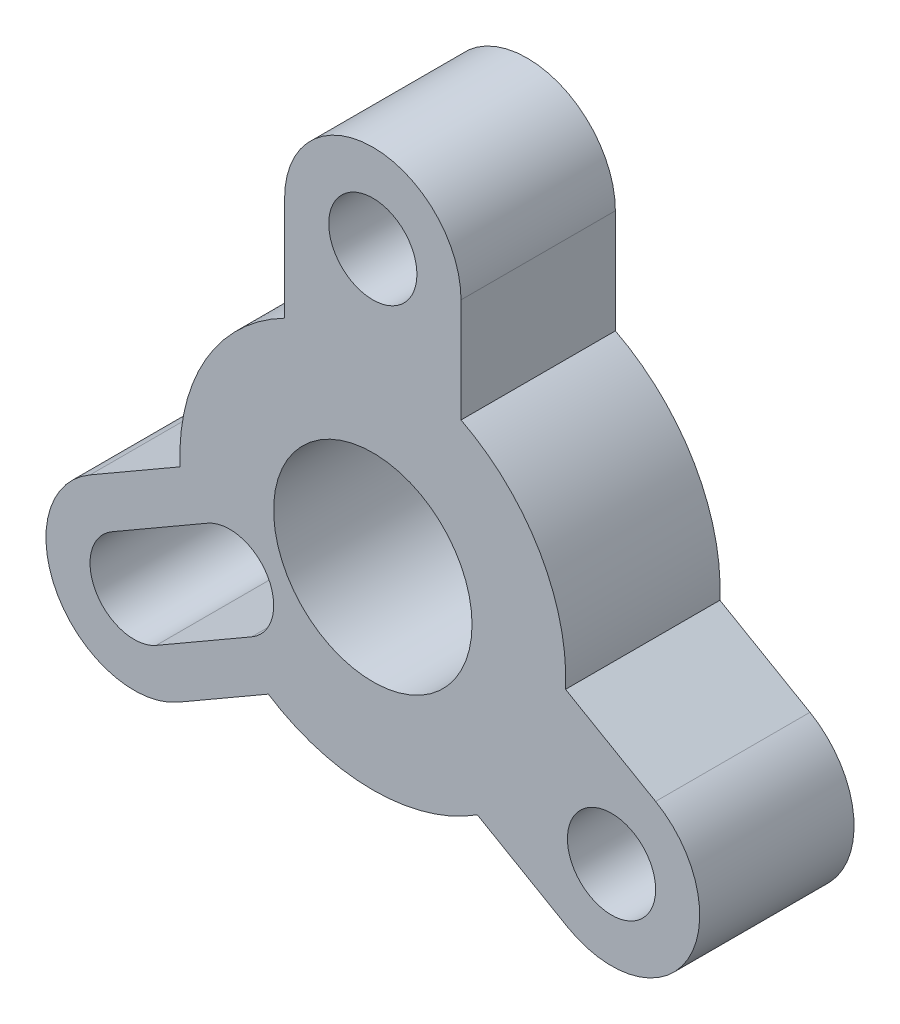
ISO-10303-21;
HEADER;
FILE_DESCRIPTION(('STEP AP214'),'2;1');
FILE_NAME('part.step','',(''),(''),'','','');
FILE_SCHEMA(('AUTOMOTIVE_DESIGN { 1 0 10303 214 1 1 1 1 }'));
ENDSEC;
DATA;
#1=APPLICATION_CONTEXT('core data for automotive mechanical design processes');
#2=APPLICATION_PROTOCOL_DEFINITION('international standard','automotive_design',2000,#1);
#3=PRODUCT_CONTEXT('',#1,'mechanical');
#4=PRODUCT('Part','Part','',(#3));
#5=PRODUCT_RELATED_PRODUCT_CATEGORY('part','',(#4));
#6=PRODUCT_DEFINITION_FORMATION('','',#4);
#7=PRODUCT_DEFINITION_CONTEXT('part definition',#1,'design');
#8=PRODUCT_DEFINITION('design','',#6,#7);
#9=PRODUCT_DEFINITION_SHAPE('','',#8);
#10=(LENGTH_UNIT() NAMED_UNIT(*) SI_UNIT(.MILLI.,.METRE.));
#11=(NAMED_UNIT(*) PLANE_ANGLE_UNIT() SI_UNIT($,.RADIAN.));
#12=(NAMED_UNIT(*) SI_UNIT($,.STERADIAN.) SOLID_ANGLE_UNIT());
#13=UNCERTAINTY_MEASURE_WITH_UNIT(LENGTH_MEASURE(1.E-05),#10,'distance_accuracy_value','');
#14=(GEOMETRIC_REPRESENTATION_CONTEXT(3) GLOBAL_UNCERTAINTY_ASSIGNED_CONTEXT((#13)) GLOBAL_UNIT_ASSIGNED_CONTEXT((#10,
#11,#12)) REPRESENTATION_CONTEXT('',''));
#15=CARTESIAN_POINT('',(0.,0.,0.));
#16=DIRECTION('',(0.,0.,1.));
#17=DIRECTION('',(1.,0.,0.));
#18=AXIS2_PLACEMENT_3D('',#15,#16,#17);
#19=CARTESIAN_POINT('',(0.,25.,14.));
#20=DIRECTION('',(0.,0.,1.));
#21=DIRECTION('',(1.,0.,0.));
#22=AXIS2_PLACEMENT_3D('',#19,#20,#21);
#23=PLANE('',#22);
#24=CARTESIAN_POINT('',(0.,25.,14.));
#25=DIRECTION('',(0.,0.,1.));
#26=DIRECTION('',(1.,0.,0.));
#27=AXIS2_PLACEMENT_3D('',#24,#25,#26);
#28=CIRCLE('',#27,4.);
#29=CARTESIAN_POINT('',(4.,25.,14.));
#30=VERTEX_POINT('',#29);
#31=EDGE_CURVE('E196',#30,#30,#28,.T.);
#32=ORIENTED_EDGE('',*,*,#31,.F.);
#33=EDGE_LOOP('',(#32));
#34=FACE_BOUND('',#33,.T.);
#35=CARTESIAN_POINT('',(0.,25.,14.));
#36=DIRECTION('',(0.,0.,1.));
#37=DIRECTION('',(1.,0.,0.));
#38=AXIS2_PLACEMENT_3D('',#35,#36,#37);
#39=CIRCLE('',#38,8.);
#40=CARTESIAN_POINT('',(8.,25.,14.));
#41=VERTEX_POINT('',#40);
#42=CARTESIAN_POINT('',(-8.,25.,14.));
#43=VERTEX_POINT('',#42);
#44=EDGE_CURVE('E208',#41,#43,#39,.T.);
#45=ORIENTED_EDGE('',*,*,#44,.T.);
#46=DIRECTION('',(0.,-1.,0.));
#47=VECTOR('',#46,1.);
#48=CARTESIAN_POINT('',(-8.,25.,14.));
#49=LINE('',#48,#47);
#50=CARTESIAN_POINT('',(-8.,15.5643824162734,14.));
#51=VERTEX_POINT('',#50);
#52=EDGE_CURVE('E211',#43,#51,#49,.T.);
#53=ORIENTED_EDGE('',*,*,#52,.T.);
#54=CARTESIAN_POINT('',(0.,0.,14.));
#55=DIRECTION('',(0.,0.,1.));
#56=DIRECTION('',(1.,0.,0.));
#57=AXIS2_PLACEMENT_3D('',#54,#55,#56);
#58=CIRCLE('',#57,17.5);
#59=CARTESIAN_POINT('',(-17.4791505667086,-0.853987977861139,14.));
#60=VERTEX_POINT('',#59);
#61=EDGE_CURVE('E214',#51,#60,#58,.T.);
#62=ORIENTED_EDGE('',*,*,#61,.T.);
#63=DIRECTION('',(-0.86602540378444,-0.499999999999999,0.));
#64=VECTOR('',#63,1.);
#65=CARTESIAN_POINT('',(-25.650635094611,-5.57179676972443,14.));
#66=LINE('',#65,#64);
#67=CARTESIAN_POINT('',(-25.650635094611,-5.57179676972443,14.));
#68=VERTEX_POINT('',#67);
#69=EDGE_CURVE('E216',#60,#68,#66,.T.);
#70=ORIENTED_EDGE('',*,*,#69,.T.);
#71=CARTESIAN_POINT('',(-21.650635094611,-12.5,14.));
#72=DIRECTION('',(0.,0.,1.));
#73=DIRECTION('',(1.,0.,0.));
#74=AXIS2_PLACEMENT_3D('',#71,#72,#73);
#75=CIRCLE('',#74,8.);
#76=CARTESIAN_POINT('',(-17.650635094611,-19.4282032302755,14.));
#77=VERTEX_POINT('',#76);
#78=EDGE_CURVE('E218',#68,#77,#75,.T.);
#79=ORIENTED_EDGE('',*,*,#78,.T.);
#80=DIRECTION('',(0.86602540378444,0.499999999999998,0.));
#81=VECTOR('',#80,1.);
#82=CARTESIAN_POINT('',(-17.650635094611,-19.4282032302755,14.));
#83=LINE('',#82,#81);
#84=CARTESIAN_POINT('',(-9.47915056670861,-14.7103944384122,14.));
#85=VERTEX_POINT('',#84);
#86=EDGE_CURVE('E220',#77,#85,#83,.T.);
#87=ORIENTED_EDGE('',*,*,#86,.T.);
#88=CARTESIAN_POINT('',(0.,0.,14.));
#89=DIRECTION('',(0.,0.,1.));
#90=DIRECTION('',(1.,0.,0.));
#91=AXIS2_PLACEMENT_3D('',#88,#89,#90);
#92=CIRCLE('',#91,17.5);
#93=CARTESIAN_POINT('',(9.4791505667085,-14.7103944384123,14.));
#94=VERTEX_POINT('',#93);
#95=EDGE_CURVE('E222',#85,#94,#92,.T.);
#96=ORIENTED_EDGE('',*,*,#95,.T.);
#97=DIRECTION('',(0.866025403784436,-0.500000000000004,0.));
#98=VECTOR('',#97,1.);
#99=CARTESIAN_POINT('',(17.6506350946109,-19.4282032302756,14.));
#100=LINE('',#99,#98);
#101=CARTESIAN_POINT('',(17.6506350946109,-19.4282032302756,14.));
#102=VERTEX_POINT('',#101);
#103=EDGE_CURVE('E224',#94,#102,#100,.T.);
#104=ORIENTED_EDGE('',*,*,#103,.T.);
#105=CARTESIAN_POINT('',(21.650635094611,-12.5,14.));
#106=DIRECTION('',(0.,0.,1.));
#107=DIRECTION('',(1.,0.,0.));
#108=AXIS2_PLACEMENT_3D('',#105,#106,#107);
#109=CIRCLE('',#108,8.);
#110=CARTESIAN_POINT('',(25.650635094611,-5.57179676972451,14.));
#111=VERTEX_POINT('',#110);
#112=EDGE_CURVE('E226',#102,#111,#109,.T.);
#113=ORIENTED_EDGE('',*,*,#112,.T.);
#114=DIRECTION('',(-0.866025403784436,0.500000000000004,0.));
#115=VECTOR('',#114,1.);
#116=CARTESIAN_POINT('',(25.6506350946109,-5.57179676972461,14.));
#117=LINE('',#116,#115);
#118=CARTESIAN_POINT('',(17.4791505667086,-0.853987977861265,14.));
#119=VERTEX_POINT('',#118);
#120=EDGE_CURVE('E228',#111,#119,#117,.T.);
#121=ORIENTED_EDGE('',*,*,#120,.T.);
#122=CARTESIAN_POINT('',(0.,0.,14.));
#123=DIRECTION('',(0.,0.,1.));
#124=DIRECTION('',(1.,0.,0.));
#125=AXIS2_PLACEMENT_3D('',#122,#123,#124);
#126=CIRCLE('',#125,17.5);
#127=CARTESIAN_POINT('',(8.,15.5643824162734,14.));
#128=VERTEX_POINT('',#127);
#129=EDGE_CURVE('E230',#119,#128,#126,.T.);
#130=ORIENTED_EDGE('',*,*,#129,.T.);
#131=DIRECTION('',(0.,1.,0.));
#132=VECTOR('',#131,1.);
#133=CARTESIAN_POINT('',(8.,25.,14.));
#134=LINE('',#133,#132);
#135=EDGE_CURVE('E232',#128,#41,#134,.T.);
#136=ORIENTED_EDGE('',*,*,#135,.T.);
#137=EDGE_LOOP('',(#45,#53,#62,#70,#79,#87,#96,#104,#113,#121,#130,#136));
#138=FACE_BOUND('',#137,.T.);
#139=CARTESIAN_POINT('',(0.,0.,14.));
#140=DIRECTION('',(0.,0.,1.));
#141=DIRECTION('',(1.,0.,0.));
#142=AXIS2_PLACEMENT_3D('',#139,#140,#141);
#143=CIRCLE('',#142,9.);
#144=CARTESIAN_POINT('',(9.,0.,14.));
#145=VERTEX_POINT('',#144);
#146=EDGE_CURVE('E202',#145,#145,#143,.T.);
#147=ORIENTED_EDGE('',*,*,#146,.F.);
#148=EDGE_LOOP('',(#147));
#149=FACE_BOUND('',#148,.T.);
#150=CARTESIAN_POINT('',(21.650635094611,-12.5,14.));
#151=DIRECTION('',(0.,0.,1.));
#152=DIRECTION('',(1.,0.,0.));
#153=AXIS2_PLACEMENT_3D('',#150,#151,#152);
#154=CIRCLE('',#153,4.00000000000012);
#155=CARTESIAN_POINT('',(25.6506350946111,-12.5,14.));
#156=VERTEX_POINT('',#155);
#157=EDGE_CURVE('E190',#156,#156,#154,.T.);
#158=ORIENTED_EDGE('',*,*,#157,.F.);
#159=EDGE_LOOP('',(#158));
#160=FACE_BOUND('',#159,.T.);
#161=DIRECTION('',(-0.86602540378444,-0.499999999999998,0.));
#162=VECTOR('',#161,1.);
#163=CARTESIAN_POINT('',(-14.9903810567666,-4.03589838486221,14.));
#164=LINE('',#163,#162);
#165=CARTESIAN_POINT('',(-14.9903810567666,-4.03589838486221,14.));
#166=VERTEX_POINT('',#165);
#167=CARTESIAN_POINT('',(-23.650635094611,-9.0358983848622,14.));
#168=VERTEX_POINT('',#167);
#169=EDGE_CURVE('E162',#166,#168,#164,.T.);
#170=ORIENTED_EDGE('',*,*,#169,.F.);
#171=CARTESIAN_POINT('',(-12.9903810567666,-7.49999999999997,14.));
#172=DIRECTION('',(0.,0.,1.));
#173=DIRECTION('',(1.,0.,0.));
#174=AXIS2_PLACEMENT_3D('',#171,#172,#173);
#175=CIRCLE('',#174,4.);
#176=CARTESIAN_POINT('',(-10.9903810567666,-10.9641016151377,14.));
#177=VERTEX_POINT('',#176);
#178=EDGE_CURVE('E154',#177,#166,#175,.T.);
#179=ORIENTED_EDGE('',*,*,#178,.F.);
#180=DIRECTION('',(0.866025403784439,0.499999999999998,0.));
#181=VECTOR('',#180,1.);
#182=CARTESIAN_POINT('',(-19.650635094611,-15.9641016151377,14.));
#183=LINE('',#182,#181);
#184=CARTESIAN_POINT('',(-19.650635094611,-15.9641016151377,14.));
#185=VERTEX_POINT('',#184);
#186=EDGE_CURVE('E176',#185,#177,#183,.T.);
#187=ORIENTED_EDGE('',*,*,#186,.F.);
#188=CARTESIAN_POINT('',(-21.650635094611,-12.5,14.));
#189=DIRECTION('',(0.,0.,1.));
#190=DIRECTION('',(1.,0.,0.));
#191=AXIS2_PLACEMENT_3D('',#188,#189,#190);
#192=CIRCLE('',#191,4.);
#193=EDGE_CURVE('E174',#168,#185,#192,.T.);
#194=ORIENTED_EDGE('',*,*,#193,.F.);
#195=EDGE_LOOP('',(#170,#179,#187,#194));
#196=FACE_BOUND('',#195,.T.);
#197=ADVANCED_FACE('F41',(#34,#138,#149,#160,#196),#23,.T.);
#198=CARTESIAN_POINT('',(0.,25.,0.));
#199=DIRECTION('',(0.,0.,1.));
#200=DIRECTION('',(1.,0.,0.));
#201=AXIS2_PLACEMENT_3D('',#198,#199,#200);
#202=PLANE('',#201);
#203=CARTESIAN_POINT('',(21.650635094611,-12.5,0.));
#204=DIRECTION('',(0.,0.,1.));
#205=DIRECTION('',(1.,0.,0.));
#206=AXIS2_PLACEMENT_3D('',#203,#204,#205);
#207=CIRCLE('',#206,4.00000000000012);
#208=CARTESIAN_POINT('',(25.6506350946111,-12.5,0.));
#209=VERTEX_POINT('',#208);
#210=EDGE_CURVE('E170',#209,#209,#207,.T.);
#211=ORIENTED_EDGE('',*,*,#210,.T.);
#212=EDGE_LOOP('',(#211));
#213=FACE_BOUND('',#212,.T.);
#214=CARTESIAN_POINT('',(0.,25.,0.));
#215=DIRECTION('',(0.,0.,1.));
#216=DIRECTION('',(1.,0.,0.));
#217=AXIS2_PLACEMENT_3D('',#214,#215,#216);
#218=CIRCLE('',#217,4.);
#219=CARTESIAN_POINT('',(4.,25.,0.));
#220=VERTEX_POINT('',#219);
#221=EDGE_CURVE('E193',#220,#220,#218,.T.);
#222=ORIENTED_EDGE('',*,*,#221,.T.);
#223=EDGE_LOOP('',(#222));
#224=FACE_BOUND('',#223,.T.);
#225=CARTESIAN_POINT('',(0.,0.,0.));
#226=DIRECTION('',(0.,0.,1.));
#227=DIRECTION('',(1.,0.,0.));
#228=AXIS2_PLACEMENT_3D('',#225,#226,#227);
#229=CIRCLE('',#228,9.);
#230=CARTESIAN_POINT('',(9.,0.,0.));
#231=VERTEX_POINT('',#230);
#232=EDGE_CURVE('E199',#231,#231,#229,.T.);
#233=ORIENTED_EDGE('',*,*,#232,.T.);
#234=EDGE_LOOP('',(#233));
#235=FACE_BOUND('',#234,.T.);
#236=CARTESIAN_POINT('',(0.,25.,0.));
#237=DIRECTION('',(0.,0.,1.));
#238=DIRECTION('',(1.,0.,0.));
#239=AXIS2_PLACEMENT_3D('',#236,#237,#238);
#240=CIRCLE('',#239,8.);
#241=CARTESIAN_POINT('',(8.,25.,0.));
#242=VERTEX_POINT('',#241);
#243=CARTESIAN_POINT('',(-8.,25.,0.));
#244=VERTEX_POINT('',#243);
#245=EDGE_CURVE('E205',#242,#244,#240,.T.);
#246=ORIENTED_EDGE('',*,*,#245,.F.);
#247=DIRECTION('',(0.,1.,0.));
#248=VECTOR('',#247,1.);
#249=CARTESIAN_POINT('',(8.,25.,0.));
#250=LINE('',#249,#248);
#251=CARTESIAN_POINT('',(8.,15.5643824162734,0.));
#252=VERTEX_POINT('',#251);
#253=EDGE_CURVE('E212',#252,#242,#250,.T.);
#254=ORIENTED_EDGE('',*,*,#253,.F.);
#255=CARTESIAN_POINT('',(0.,0.,0.));
#256=DIRECTION('',(0.,0.,1.));
#257=DIRECTION('',(1.,0.,0.));
#258=AXIS2_PLACEMENT_3D('',#255,#256,#257);
#259=CIRCLE('',#258,17.5);
#260=CARTESIAN_POINT('',(17.4791505667086,-0.853987977861265,0.));
#261=VERTEX_POINT('',#260);
#262=EDGE_CURVE('E255',#261,#252,#259,.T.);
#263=ORIENTED_EDGE('',*,*,#262,.F.);
#264=DIRECTION('',(-0.866025403784436,0.500000000000004,0.));
#265=VECTOR('',#264,1.);
#266=CARTESIAN_POINT('',(25.6506350946109,-5.57179676972461,0.));
#267=LINE('',#266,#265);
#268=CARTESIAN_POINT('',(25.650635094611,-5.57179676972451,0.));
#269=VERTEX_POINT('',#268);
#270=EDGE_CURVE('E253',#269,#261,#267,.T.);
#271=ORIENTED_EDGE('',*,*,#270,.F.);
#272=CARTESIAN_POINT('',(21.650635094611,-12.5,0.));
#273=DIRECTION('',(0.,0.,1.));
#274=DIRECTION('',(1.,0.,0.));
#275=AXIS2_PLACEMENT_3D('',#272,#273,#274);
#276=CIRCLE('',#275,8.);
#277=CARTESIAN_POINT('',(17.6506350946109,-19.4282032302756,0.));
#278=VERTEX_POINT('',#277);
#279=EDGE_CURVE('E251',#278,#269,#276,.T.);
#280=ORIENTED_EDGE('',*,*,#279,.F.);
#281=DIRECTION('',(0.866025403784436,-0.500000000000004,0.));
#282=VECTOR('',#281,1.);
#283=CARTESIAN_POINT('',(17.6506350946109,-19.4282032302756,0.));
#284=LINE('',#283,#282);
#285=CARTESIAN_POINT('',(9.4791505667085,-14.7103944384123,0.));
#286=VERTEX_POINT('',#285);
#287=EDGE_CURVE('E249',#286,#278,#284,.T.);
#288=ORIENTED_EDGE('',*,*,#287,.F.);
#289=CARTESIAN_POINT('',(0.,0.,0.));
#290=DIRECTION('',(0.,0.,1.));
#291=DIRECTION('',(1.,0.,0.));
#292=AXIS2_PLACEMENT_3D('',#289,#290,#291);
#293=CIRCLE('',#292,17.5);
#294=CARTESIAN_POINT('',(-9.47915056670861,-14.7103944384122,0.));
#295=VERTEX_POINT('',#294);
#296=EDGE_CURVE('E247',#295,#286,#293,.T.);
#297=ORIENTED_EDGE('',*,*,#296,.F.);
#298=DIRECTION('',(0.86602540378444,0.499999999999998,0.));
#299=VECTOR('',#298,1.);
#300=CARTESIAN_POINT('',(-17.650635094611,-19.4282032302755,0.));
#301=LINE('',#300,#299);
#302=CARTESIAN_POINT('',(-17.650635094611,-19.4282032302755,0.));
#303=VERTEX_POINT('',#302);
#304=EDGE_CURVE('E245',#303,#295,#301,.T.);
#305=ORIENTED_EDGE('',*,*,#304,.F.);
#306=CARTESIAN_POINT('',(-21.650635094611,-12.5,0.));
#307=DIRECTION('',(0.,0.,1.));
#308=DIRECTION('',(1.,0.,0.));
#309=AXIS2_PLACEMENT_3D('',#306,#307,#308);
#310=CIRCLE('',#309,8.);
#311=CARTESIAN_POINT('',(-25.650635094611,-5.57179676972443,0.));
#312=VERTEX_POINT('',#311);
#313=EDGE_CURVE('E243',#312,#303,#310,.T.);
#314=ORIENTED_EDGE('',*,*,#313,.F.);
#315=DIRECTION('',(-0.86602540378444,-0.499999999999999,0.));
#316=VECTOR('',#315,1.);
#317=CARTESIAN_POINT('',(-25.650635094611,-5.57179676972443,0.));
#318=LINE('',#317,#316);
#319=CARTESIAN_POINT('',(-17.4791505667086,-0.853987977861139,0.));
#320=VERTEX_POINT('',#319);
#321=EDGE_CURVE('E241',#320,#312,#318,.T.);
#322=ORIENTED_EDGE('',*,*,#321,.F.);
#323=CARTESIAN_POINT('',(0.,0.,0.));
#324=DIRECTION('',(0.,0.,1.));
#325=DIRECTION('',(1.,0.,0.));
#326=AXIS2_PLACEMENT_3D('',#323,#324,#325);
#327=CIRCLE('',#326,17.5);
#328=CARTESIAN_POINT('',(-8.,15.5643824162734,0.));
#329=VERTEX_POINT('',#328);
#330=EDGE_CURVE('E239',#329,#320,#327,.T.);
#331=ORIENTED_EDGE('',*,*,#330,.F.);
#332=DIRECTION('',(0.,-1.,0.));
#333=VECTOR('',#332,1.);
#334=CARTESIAN_POINT('',(-8.,25.,0.));
#335=LINE('',#334,#333);
#336=EDGE_CURVE('E237',#244,#329,#335,.T.);
#337=ORIENTED_EDGE('',*,*,#336,.F.);
#338=EDGE_LOOP('',(#246,#254,#263,#271,#280,#288,#297,#305,#314,#322,#331,#337));
#339=FACE_BOUND('',#338,.T.);
#340=CARTESIAN_POINT('',(-12.9903810567666,-7.49999999999997,0.));
#341=DIRECTION('',(0.,0.,1.));
#342=DIRECTION('',(1.,0.,0.));
#343=AXIS2_PLACEMENT_3D('',#340,#341,#342);
#344=CIRCLE('',#343,4.);
#345=CARTESIAN_POINT('',(-10.9903810567666,-10.9641016151377,0.));
#346=VERTEX_POINT('',#345);
#347=CARTESIAN_POINT('',(-14.9903810567666,-4.03589838486221,0.));
#348=VERTEX_POINT('',#347);
#349=EDGE_CURVE('E64',#346,#348,#344,.T.);
#350=ORIENTED_EDGE('',*,*,#349,.T.);
#351=DIRECTION('',(-0.86602540378444,-0.499999999999998,0.));
#352=VECTOR('',#351,1.);
#353=CARTESIAN_POINT('',(-14.9903810567666,-4.03589838486221,0.));
#354=LINE('',#353,#352);
#355=CARTESIAN_POINT('',(-23.650635094611,-9.0358983848622,0.));
#356=VERTEX_POINT('',#355);
#357=EDGE_CURVE('E169',#348,#356,#354,.T.);
#358=ORIENTED_EDGE('',*,*,#357,.T.);
#359=CARTESIAN_POINT('',(-21.650635094611,-12.5,0.));
#360=DIRECTION('',(0.,0.,1.));
#361=DIRECTION('',(1.,0.,0.));
#362=AXIS2_PLACEMENT_3D('',#359,#360,#361);
#363=CIRCLE('',#362,4.);
#364=CARTESIAN_POINT('',(-19.650635094611,-15.9641016151377,0.));
#365=VERTEX_POINT('',#364);
#366=EDGE_CURVE('E182',#356,#365,#363,.T.);
#367=ORIENTED_EDGE('',*,*,#366,.T.);
#368=DIRECTION('',(0.866025403784439,0.499999999999998,0.));
#369=VECTOR('',#368,1.);
#370=CARTESIAN_POINT('',(-19.650635094611,-15.9641016151377,0.));
#371=LINE('',#370,#369);
#372=EDGE_CURVE('E163',#365,#346,#371,.T.);
#373=ORIENTED_EDGE('',*,*,#372,.T.);
#374=EDGE_LOOP('',(#350,#358,#367,#373));
#375=FACE_BOUND('',#374,.T.);
#376=ADVANCED_FACE('F297',(#213,#224,#235,#339,#375),#202,.F.);
#377=CARTESIAN_POINT('',(0.,25.,14.));
#378=DIRECTION('',(0.,0.,-1.));
#379=DIRECTION('',(-1.,0.,0.));
#380=AXIS2_PLACEMENT_3D('',#377,#378,#379);
#381=CYLINDRICAL_SURFACE('',#380,8.);
#382=ORIENTED_EDGE('',*,*,#245,.T.);
#383=DIRECTION('',(0.,0.,-1.));
#384=VECTOR('',#383,1.);
#385=CARTESIAN_POINT('',(-8.,25.,14.));
#386=LINE('',#385,#384);
#387=EDGE_CURVE('E11',#43,#244,#386,.T.);
#388=ORIENTED_EDGE('',*,*,#387,.F.);
#389=ORIENTED_EDGE('',*,*,#44,.F.);
#390=DIRECTION('',(0.,0.,-1.));
#391=VECTOR('',#390,1.);
#392=CARTESIAN_POINT('',(8.,25.,14.));
#393=LINE('',#392,#391);
#394=EDGE_CURVE('E234',#41,#242,#393,.T.);
#395=ORIENTED_EDGE('',*,*,#394,.T.);
#396=EDGE_LOOP('',(#382,#388,#389,#395));
#397=FACE_BOUND('',#396,.T.);
#398=ADVANCED_FACE('F43',(#397),#381,.T.);
#399=CARTESIAN_POINT('',(-8.,25.,14.));
#400=DIRECTION('',(1.,0.,0.));
#401=DIRECTION('',(0.,0.,-1.));
#402=AXIS2_PLACEMENT_3D('',#399,#400,#401);
#403=PLANE('',#402);
#404=ORIENTED_EDGE('',*,*,#336,.T.);
#405=DIRECTION('',(0.,0.,-1.));
#406=VECTOR('',#405,1.);
#407=CARTESIAN_POINT('',(-8.,15.5643824162734,14.));
#408=LINE('',#407,#406);
#409=EDGE_CURVE('E49',#51,#329,#408,.T.);
#410=ORIENTED_EDGE('',*,*,#409,.F.);
#411=ORIENTED_EDGE('',*,*,#52,.F.);
#412=ORIENTED_EDGE('',*,*,#387,.T.);
#413=EDGE_LOOP('',(#404,#410,#411,#412));
#414=FACE_BOUND('',#413,.T.);
#415=ADVANCED_FACE('F315',(#414),#403,.F.);
#416=CARTESIAN_POINT('',(0.,0.,14.));
#417=DIRECTION('',(0.,0.,-1.));
#418=DIRECTION('',(-1.,0.,0.));
#419=AXIS2_PLACEMENT_3D('',#416,#417,#418);
#420=CYLINDRICAL_SURFACE('',#419,17.5);
#421=ORIENTED_EDGE('',*,*,#330,.T.);
#422=DIRECTION('',(0.,0.,-1.));
#423=VECTOR('',#422,1.);
#424=CARTESIAN_POINT('',(-17.4791505667086,-0.853987977861139,14.));
#425=LINE('',#424,#423);
#426=EDGE_CURVE('E284',#60,#320,#425,.T.);
#427=ORIENTED_EDGE('',*,*,#426,.F.);
#428=ORIENTED_EDGE('',*,*,#61,.F.);
#429=ORIENTED_EDGE('',*,*,#409,.T.);
#430=EDGE_LOOP('',(#421,#427,#428,#429));
#431=FACE_BOUND('',#430,.T.);
#432=ADVANCED_FACE('F291',(#431),#420,.T.);
#433=CARTESIAN_POINT('',(-25.650635094611,-5.57179676972443,14.));
#434=DIRECTION('',(0.499999999999999,-0.866025403784439,0.));
#435=DIRECTION('',(0.866025403784439,0.499999999999999,0.));
#436=AXIS2_PLACEMENT_3D('',#433,#434,#435);
#437=PLANE('',#436);
#438=ORIENTED_EDGE('',*,*,#321,.T.);
#439=DIRECTION('',(0.,0.,-1.));
#440=VECTOR('',#439,1.);
#441=CARTESIAN_POINT('',(-25.650635094611,-5.57179676972443,14.));
#442=LINE('',#441,#440);
#443=EDGE_CURVE('E281',#68,#312,#442,.T.);
#444=ORIENTED_EDGE('',*,*,#443,.F.);
#445=ORIENTED_EDGE('',*,*,#69,.F.);
#446=ORIENTED_EDGE('',*,*,#426,.T.);
#447=EDGE_LOOP('',(#438,#444,#445,#446));
#448=FACE_BOUND('',#447,.T.);
#449=ADVANCED_FACE('F303',(#448),#437,.F.);
#450=CARTESIAN_POINT('',(-21.650635094611,-12.5,14.));
#451=DIRECTION('',(0.,0.,-1.));
#452=DIRECTION('',(-1.,0.,0.));
#453=AXIS2_PLACEMENT_3D('',#450,#451,#452);
#454=CYLINDRICAL_SURFACE('',#453,8.);
#455=ORIENTED_EDGE('',*,*,#313,.T.);
#456=DIRECTION('',(0.,0.,-1.));
#457=VECTOR('',#456,1.);
#458=CARTESIAN_POINT('',(-17.650635094611,-19.4282032302755,14.));
#459=LINE('',#458,#457);
#460=EDGE_CURVE('E278',#77,#303,#459,.T.);
#461=ORIENTED_EDGE('',*,*,#460,.F.);
#462=ORIENTED_EDGE('',*,*,#78,.F.);
#463=ORIENTED_EDGE('',*,*,#443,.T.);
#464=EDGE_LOOP('',(#455,#461,#462,#463));
#465=FACE_BOUND('',#464,.T.);
#466=ADVANCED_FACE('F307',(#465),#454,.T.);
#467=CARTESIAN_POINT('',(-17.650635094611,-19.4282032302755,14.));
#468=DIRECTION('',(-0.499999999999998,0.86602540378444,0.));
#469=DIRECTION('',(-0.86602540378444,-0.499999999999998,0.));
#470=AXIS2_PLACEMENT_3D('',#467,#468,#469);
#471=PLANE('',#470);
#472=ORIENTED_EDGE('',*,*,#304,.T.);
#473=DIRECTION('',(0.,0.,-1.));
#474=VECTOR('',#473,1.);
#475=CARTESIAN_POINT('',(-9.47915056670861,-14.7103944384122,14.));
#476=LINE('',#475,#474);
#477=EDGE_CURVE('E275',#85,#295,#476,.T.);
#478=ORIENTED_EDGE('',*,*,#477,.F.);
#479=ORIENTED_EDGE('',*,*,#86,.F.);
#480=ORIENTED_EDGE('',*,*,#460,.T.);
#481=EDGE_LOOP('',(#472,#478,#479,#480));
#482=FACE_BOUND('',#481,.T.);
#483=ADVANCED_FACE('F348',(#482),#471,.F.);
#484=CARTESIAN_POINT('',(0.,0.,14.));
#485=DIRECTION('',(0.,0.,-1.));
#486=DIRECTION('',(-1.,0.,0.));
#487=AXIS2_PLACEMENT_3D('',#484,#485,#486);
#488=CYLINDRICAL_SURFACE('',#487,17.5);
#489=ORIENTED_EDGE('',*,*,#296,.T.);
#490=DIRECTION('',(0.,0.,-1.));
#491=VECTOR('',#490,1.);
#492=CARTESIAN_POINT('',(9.4791505667085,-14.7103944384123,14.));
#493=LINE('',#492,#491);
#494=EDGE_CURVE('E272',#94,#286,#493,.T.);
#495=ORIENTED_EDGE('',*,*,#494,.F.);
#496=ORIENTED_EDGE('',*,*,#95,.F.);
#497=ORIENTED_EDGE('',*,*,#477,.T.);
#498=EDGE_LOOP('',(#489,#495,#496,#497));
#499=FACE_BOUND('',#498,.T.);
#500=ADVANCED_FACE('F346',(#499),#488,.T.);
#501=CARTESIAN_POINT('',(17.6506350946109,-19.4282032302756,14.));
#502=DIRECTION('',(0.500000000000004,0.866025403784436,0.));
#503=DIRECTION('',(-0.866025403784436,0.500000000000004,0.));
#504=AXIS2_PLACEMENT_3D('',#501,#502,#503);
#505=PLANE('',#504);
#506=ORIENTED_EDGE('',*,*,#287,.T.);
#507=DIRECTION('',(0.,0.,-1.));
#508=VECTOR('',#507,1.);
#509=CARTESIAN_POINT('',(17.6506350946109,-19.4282032302756,14.));
#510=LINE('',#509,#508);
#511=EDGE_CURVE('E269',#102,#278,#510,.T.);
#512=ORIENTED_EDGE('',*,*,#511,.F.);
#513=ORIENTED_EDGE('',*,*,#103,.F.);
#514=ORIENTED_EDGE('',*,*,#494,.T.);
#515=EDGE_LOOP('',(#506,#512,#513,#514));
#516=FACE_BOUND('',#515,.T.);
#517=ADVANCED_FACE('F342',(#516),#505,.F.);
#518=CARTESIAN_POINT('',(21.650635094611,-12.5,14.));
#519=DIRECTION('',(0.,0.,-1.));
#520=DIRECTION('',(-1.,0.,0.));
#521=AXIS2_PLACEMENT_3D('',#518,#519,#520);
#522=CYLINDRICAL_SURFACE('',#521,8.);
#523=ORIENTED_EDGE('',*,*,#279,.T.);
#524=DIRECTION('',(0.,0.,-1.));
#525=VECTOR('',#524,1.);
#526=CARTESIAN_POINT('',(25.650635094611,-5.57179676972451,14.));
#527=LINE('',#526,#525);
#528=EDGE_CURVE('E266',#111,#269,#527,.T.);
#529=ORIENTED_EDGE('',*,*,#528,.F.);
#530=ORIENTED_EDGE('',*,*,#112,.F.);
#531=ORIENTED_EDGE('',*,*,#511,.T.);
#532=EDGE_LOOP('',(#523,#529,#530,#531));
#533=FACE_BOUND('',#532,.T.);
#534=ADVANCED_FACE('F337',(#533),#522,.T.);
#535=CARTESIAN_POINT('',(25.6506350946109,-5.57179676972461,14.));
#536=DIRECTION('',(-0.500000000000004,-0.866025403784436,0.));
#537=DIRECTION('',(0.866025403784436,-0.500000000000004,0.));
#538=AXIS2_PLACEMENT_3D('',#535,#536,#537);
#539=PLANE('',#538);
#540=ORIENTED_EDGE('',*,*,#270,.T.);
#541=DIRECTION('',(0.,0.,-1.));
#542=VECTOR('',#541,1.);
#543=CARTESIAN_POINT('',(17.4791505667086,-0.853987977861265,14.));
#544=LINE('',#543,#542);
#545=EDGE_CURVE('E263',#119,#261,#544,.T.);
#546=ORIENTED_EDGE('',*,*,#545,.F.);
#547=ORIENTED_EDGE('',*,*,#120,.F.);
#548=ORIENTED_EDGE('',*,*,#528,.T.);
#549=EDGE_LOOP('',(#540,#546,#547,#548));
#550=FACE_BOUND('',#549,.T.);
#551=ADVANCED_FACE('F331',(#550),#539,.F.);
#552=CARTESIAN_POINT('',(0.,0.,14.));
#553=DIRECTION('',(0.,0.,-1.));
#554=DIRECTION('',(-1.,0.,0.));
#555=AXIS2_PLACEMENT_3D('',#552,#553,#554);
#556=CYLINDRICAL_SURFACE('',#555,17.5);
#557=ORIENTED_EDGE('',*,*,#262,.T.);
#558=DIRECTION('',(0.,0.,-1.));
#559=VECTOR('',#558,1.);
#560=CARTESIAN_POINT('',(8.,15.5643824162734,14.));
#561=LINE('',#560,#559);
#562=EDGE_CURVE('E260',#128,#252,#561,.T.);
#563=ORIENTED_EDGE('',*,*,#562,.F.);
#564=ORIENTED_EDGE('',*,*,#129,.F.);
#565=ORIENTED_EDGE('',*,*,#545,.T.);
#566=EDGE_LOOP('',(#557,#563,#564,#565));
#567=FACE_BOUND('',#566,.T.);
#568=ADVANCED_FACE('F327',(#567),#556,.T.);
#569=CARTESIAN_POINT('',(8.,25.,14.));
#570=DIRECTION('',(-1.,0.,0.));
#571=DIRECTION('',(0.,0.,1.));
#572=AXIS2_PLACEMENT_3D('',#569,#570,#571);
#573=PLANE('',#572);
#574=ORIENTED_EDGE('',*,*,#253,.T.);
#575=ORIENTED_EDGE('',*,*,#394,.F.);
#576=ORIENTED_EDGE('',*,*,#135,.F.);
#577=ORIENTED_EDGE('',*,*,#562,.T.);
#578=EDGE_LOOP('',(#574,#575,#576,#577));
#579=FACE_BOUND('',#578,.T.);
#580=ADVANCED_FACE('F322',(#579),#573,.F.);
#581=CARTESIAN_POINT('',(0.,0.,14.));
#582=DIRECTION('',(0.,0.,-1.));
#583=DIRECTION('',(-1.,0.,0.));
#584=AXIS2_PLACEMENT_3D('',#581,#582,#583);
#585=CYLINDRICAL_SURFACE('',#584,9.);
#586=ORIENTED_EDGE('',*,*,#146,.T.);
#587=EDGE_LOOP('',(#586));
#588=FACE_BOUND('',#587,.T.);
#589=ORIENTED_EDGE('',*,*,#232,.F.);
#590=EDGE_LOOP('',(#589));
#591=FACE_BOUND('',#590,.T.);
#592=ADVANCED_FACE('F367',(#588,#591),#585,.F.);
#593=CARTESIAN_POINT('',(0.,25.,14.));
#594=DIRECTION('',(0.,0.,-1.));
#595=DIRECTION('',(-1.,0.,0.));
#596=AXIS2_PLACEMENT_3D('',#593,#594,#595);
#597=CYLINDRICAL_SURFACE('',#596,4.);
#598=ORIENTED_EDGE('',*,*,#31,.T.);
#599=EDGE_LOOP('',(#598));
#600=FACE_BOUND('',#599,.T.);
#601=ORIENTED_EDGE('',*,*,#221,.F.);
#602=EDGE_LOOP('',(#601));
#603=FACE_BOUND('',#602,.T.);
#604=ADVANCED_FACE('F405',(#600,#603),#597,.F.);
#605=CARTESIAN_POINT('',(21.650635094611,-12.5,14.));
#606=DIRECTION('',(0.,0.,-1.));
#607=DIRECTION('',(-1.,0.,0.));
#608=AXIS2_PLACEMENT_3D('',#605,#606,#607);
#609=CYLINDRICAL_SURFACE('',#608,4.00000000000012);
#610=ORIENTED_EDGE('',*,*,#157,.T.);
#611=EDGE_LOOP('',(#610));
#612=FACE_BOUND('',#611,.T.);
#613=ORIENTED_EDGE('',*,*,#210,.F.);
#614=EDGE_LOOP('',(#613));
#615=FACE_BOUND('',#614,.T.);
#616=ADVANCED_FACE('F412',(#612,#615),#609,.F.);
#617=CARTESIAN_POINT('',(-12.9903810567666,-7.49999999999997,14.));
#618=DIRECTION('',(0.,0.,-1.));
#619=DIRECTION('',(-1.,0.,0.));
#620=AXIS2_PLACEMENT_3D('',#617,#618,#619);
#621=CYLINDRICAL_SURFACE('',#620,4.);
#622=ORIENTED_EDGE('',*,*,#349,.F.);
#623=DIRECTION('',(0.,0.,-1.));
#624=VECTOR('',#623,1.);
#625=CARTESIAN_POINT('',(-10.9903810567666,-10.9641016151377,14.));
#626=LINE('',#625,#624);
#627=EDGE_CURVE('E158',#177,#346,#626,.T.);
#628=ORIENTED_EDGE('',*,*,#627,.F.);
#629=ORIENTED_EDGE('',*,*,#178,.T.);
#630=DIRECTION('',(0.,0.,-1.));
#631=VECTOR('',#630,1.);
#632=CARTESIAN_POINT('',(-14.9903810567666,-4.03589838486221,14.));
#633=LINE('',#632,#631);
#634=EDGE_CURVE('E157',#166,#348,#633,.T.);
#635=ORIENTED_EDGE('',*,*,#634,.T.);
#636=EDGE_LOOP('',(#622,#628,#629,#635));
#637=FACE_BOUND('',#636,.T.);
#638=ADVANCED_FACE('F156',(#637),#621,.F.);
#639=CARTESIAN_POINT('',(-14.9903810567666,-4.03589838486221,14.));
#640=DIRECTION('',(0.499999999999998,-0.86602540378444,0.));
#641=DIRECTION('',(0.86602540378444,0.499999999999998,0.));
#642=AXIS2_PLACEMENT_3D('',#639,#640,#641);
#643=PLANE('',#642);
#644=ORIENTED_EDGE('',*,*,#357,.F.);
#645=ORIENTED_EDGE('',*,*,#634,.F.);
#646=ORIENTED_EDGE('',*,*,#169,.T.);
#647=DIRECTION('',(0.,0.,-1.));
#648=VECTOR('',#647,1.);
#649=CARTESIAN_POINT('',(-23.650635094611,-9.0358983848622,14.));
#650=LINE('',#649,#648);
#651=EDGE_CURVE('E171',#168,#356,#650,.T.);
#652=ORIENTED_EDGE('',*,*,#651,.T.);
#653=EDGE_LOOP('',(#644,#645,#646,#652));
#654=FACE_BOUND('',#653,.T.);
#655=ADVANCED_FACE('F166',(#654),#643,.T.);
#656=CARTESIAN_POINT('',(-21.650635094611,-12.5,14.));
#657=DIRECTION('',(0.,0.,-1.));
#658=DIRECTION('',(-1.,0.,0.));
#659=AXIS2_PLACEMENT_3D('',#656,#657,#658);
#660=CYLINDRICAL_SURFACE('',#659,4.);
#661=ORIENTED_EDGE('',*,*,#366,.F.);
#662=ORIENTED_EDGE('',*,*,#651,.F.);
#663=ORIENTED_EDGE('',*,*,#193,.T.);
#664=DIRECTION('',(0.,0.,-1.));
#665=VECTOR('',#664,1.);
#666=CARTESIAN_POINT('',(-19.650635094611,-15.9641016151377,14.));
#667=LINE('',#666,#665);
#668=EDGE_CURVE('E56',#185,#365,#667,.T.);
#669=ORIENTED_EDGE('',*,*,#668,.T.);
#670=EDGE_LOOP('',(#661,#662,#663,#669));
#671=FACE_BOUND('',#670,.T.);
#672=ADVANCED_FACE('F432',(#671),#660,.F.);
#673=CARTESIAN_POINT('',(-19.650635094611,-15.9641016151377,14.));
#674=DIRECTION('',(-0.499999999999998,0.866025403784439,0.));
#675=DIRECTION('',(-0.86602540378444,-0.499999999999998,0.));
#676=AXIS2_PLACEMENT_3D('',#673,#674,#675);
#677=PLANE('',#676);
#678=ORIENTED_EDGE('',*,*,#372,.F.);
#679=ORIENTED_EDGE('',*,*,#668,.F.);
#680=ORIENTED_EDGE('',*,*,#186,.T.);
#681=ORIENTED_EDGE('',*,*,#627,.T.);
#682=EDGE_LOOP('',(#678,#679,#680,#681));
#683=FACE_BOUND('',#682,.T.);
#684=ADVANCED_FACE('F439',(#683),#677,.T.);
#685=CLOSED_SHELL('',(#197,#376,#398,#415,#432,#449,#466,#483,#500,#517,#534,#551,#568,#580,
#592,#604,#616,#638,#655,#672,#684));
#686=MANIFOLD_SOLID_BREP('B2',#685);
#687=ADVANCED_BREP_SHAPE_REPRESENTATION('',(#18,#686),#14);
#688=SHAPE_DEFINITION_REPRESENTATION(#9,#687);
ENDSEC;
END-ISO-10303-21;
